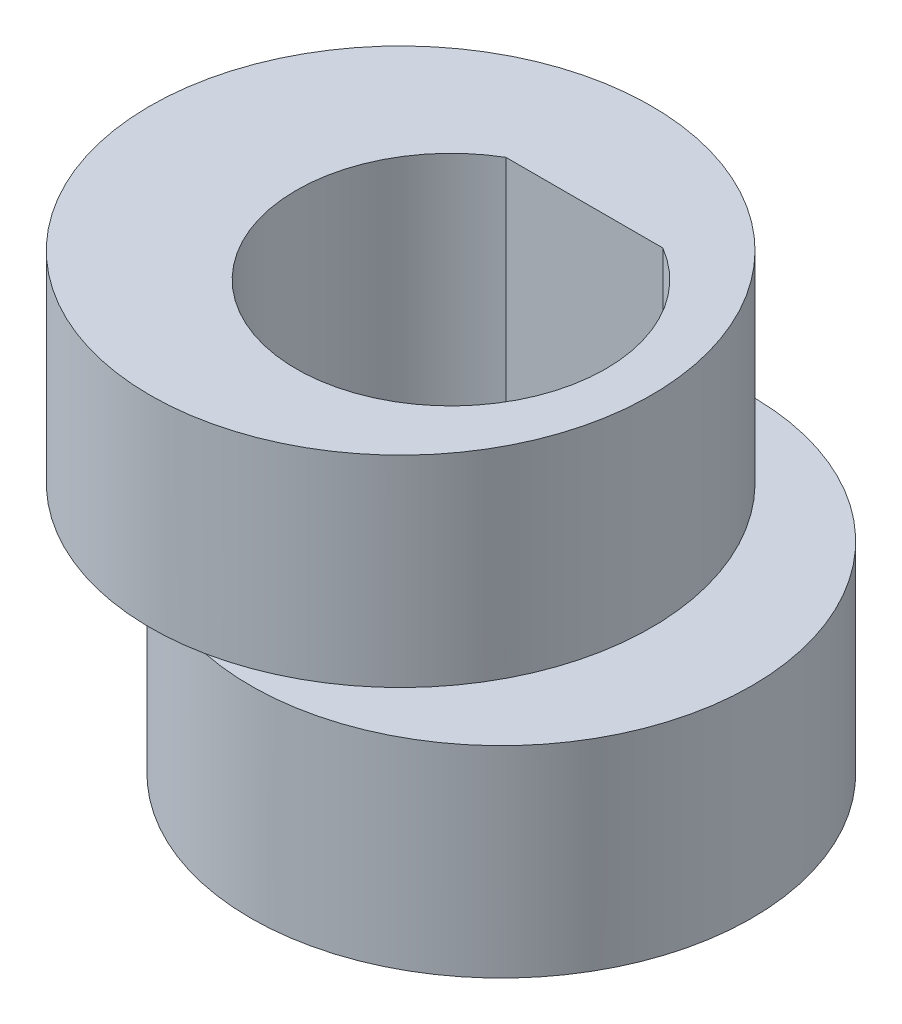
ISO-10303-21;
HEADER;
FILE_DESCRIPTION(('STEP AP214'),'2;1');
FILE_NAME('part.step','',(''),(''),'','','');
FILE_SCHEMA(('AUTOMOTIVE_DESIGN { 1 0 10303 214 1 1 1 1 }'));
ENDSEC;
DATA;
#1=APPLICATION_CONTEXT('core data for automotive mechanical design processes');
#2=APPLICATION_PROTOCOL_DEFINITION('international standard','automotive_design',2000,#1);
#3=PRODUCT_CONTEXT('',#1,'mechanical');
#4=PRODUCT('Part','Part','',(#3));
#5=PRODUCT_RELATED_PRODUCT_CATEGORY('part','',(#4));
#6=PRODUCT_DEFINITION_FORMATION('','',#4);
#7=PRODUCT_DEFINITION_CONTEXT('part definition',#1,'design');
#8=PRODUCT_DEFINITION('design','',#6,#7);
#9=PRODUCT_DEFINITION_SHAPE('','',#8);
#10=(LENGTH_UNIT() NAMED_UNIT(*) SI_UNIT(.MILLI.,.METRE.));
#11=(NAMED_UNIT(*) PLANE_ANGLE_UNIT() SI_UNIT($,.RADIAN.));
#12=(NAMED_UNIT(*) SI_UNIT($,.STERADIAN.) SOLID_ANGLE_UNIT());
#13=UNCERTAINTY_MEASURE_WITH_UNIT(LENGTH_MEASURE(1.E-05),#10,'distance_accuracy_value','');
#14=(GEOMETRIC_REPRESENTATION_CONTEXT(3) GLOBAL_UNCERTAINTY_ASSIGNED_CONTEXT((#13)) GLOBAL_UNIT_ASSIGNED_CONTEXT((#10,
#11,#12)) REPRESENTATION_CONTEXT('',''));
#15=CARTESIAN_POINT('',(0.,0.,0.));
#16=DIRECTION('',(0.,0.,1.));
#17=DIRECTION('',(1.,0.,0.));
#18=AXIS2_PLACEMENT_3D('',#15,#16,#17);
#19=CARTESIAN_POINT('',(1.,0.,0.));
#20=DIRECTION('',(0.,1.,0.));
#21=DIRECTION('',(0.,0.,1.));
#22=AXIS2_PLACEMENT_3D('',#19,#20,#21);
#23=PLANE('',#22);
#24=CARTESIAN_POINT('',(1.,0.,0.));
#25=DIRECTION('',(0.,1.,0.));
#26=DIRECTION('',(0.,0.,1.));
#27=AXIS2_PLACEMENT_3D('',#24,#25,#26);
#28=CIRCLE('',#27,4.98);
#29=CARTESIAN_POINT('',(1.,0.,4.98));
#30=VERTEX_POINT('',#29);
#31=EDGE_CURVE('E39',#30,#30,#28,.T.);
#32=ORIENTED_EDGE('',*,*,#31,.F.);
#33=EDGE_LOOP('',(#32));
#34=FACE_BOUND('',#33,.T.);
#35=CARTESIAN_POINT('',(0.,0.,0.));
#36=DIRECTION('',(0.,1.,0.));
#37=DIRECTION('',(0.,0.,1.));
#38=AXIS2_PLACEMENT_3D('',#35,#36,#37);
#39=CIRCLE('',#38,3.075);
#40=CARTESIAN_POINT('',(-1.55984774898065,0.,-2.65));
#41=VERTEX_POINT('',#40);
#42=CARTESIAN_POINT('',(1.55984774898065,0.,-2.65));
#43=VERTEX_POINT('',#42);
#44=EDGE_CURVE('E51',#41,#43,#39,.T.);
#45=ORIENTED_EDGE('',*,*,#44,.T.);
#46=DIRECTION('',(-1.,0.,0.));
#47=VECTOR('',#46,1.);
#48=CARTESIAN_POINT('',(-1.55984774898065,0.,-2.65));
#49=LINE('',#48,#47);
#50=EDGE_CURVE('E81',#43,#41,#49,.T.);
#51=ORIENTED_EDGE('',*,*,#50,.T.);
#52=EDGE_LOOP('',(#45,#51));
#53=FACE_BOUND('',#52,.T.);
#54=ADVANCED_FACE('F35',(#34,#53),#23,.F.);
#55=CARTESIAN_POINT('',(-1.,8.,0.));
#56=DIRECTION('',(0.,1.,0.));
#57=DIRECTION('',(0.,0.,1.));
#58=AXIS2_PLACEMENT_3D('',#55,#56,#57);
#59=PLANE('',#58);
#60=CARTESIAN_POINT('',(-1.,8.,0.));
#61=DIRECTION('',(0.,1.,0.));
#62=DIRECTION('',(0.,0.,1.));
#63=AXIS2_PLACEMENT_3D('',#60,#61,#62);
#64=CIRCLE('',#63,4.98);
#65=CARTESIAN_POINT('',(-1.,8.,4.98));
#66=VERTEX_POINT('',#65);
#67=EDGE_CURVE('E88',#66,#66,#64,.T.);
#68=ORIENTED_EDGE('',*,*,#67,.T.);
#69=EDGE_LOOP('',(#68));
#70=FACE_BOUND('',#69,.T.);
#71=DIRECTION('',(-1.,0.,0.));
#72=VECTOR('',#71,1.);
#73=CARTESIAN_POINT('',(-1.55984774898065,8.,-2.65));
#74=LINE('',#73,#72);
#75=CARTESIAN_POINT('',(1.55984774898065,8.,-2.65));
#76=VERTEX_POINT('',#75);
#77=CARTESIAN_POINT('',(-1.55984774898065,8.,-2.65));
#78=VERTEX_POINT('',#77);
#79=EDGE_CURVE('E70',#76,#78,#74,.T.);
#80=ORIENTED_EDGE('',*,*,#79,.F.);
#81=CARTESIAN_POINT('',(0.,8.,0.));
#82=DIRECTION('',(0.,1.,0.));
#83=DIRECTION('',(0.,0.,1.));
#84=AXIS2_PLACEMENT_3D('',#81,#82,#83);
#85=CIRCLE('',#84,3.075);
#86=EDGE_CURVE('E76',#78,#76,#85,.T.);
#87=ORIENTED_EDGE('',*,*,#86,.F.);
#88=EDGE_LOOP('',(#80,#87));
#89=FACE_BOUND('',#88,.T.);
#90=ADVANCED_FACE('F80',(#70,#89),#59,.T.);
#91=CARTESIAN_POINT('',(1.,4.,0.));
#92=DIRECTION('',(0.,-1.,0.));
#93=DIRECTION('',(0.,0.,-1.));
#94=AXIS2_PLACEMENT_3D('',#91,#92,#93);
#95=CYLINDRICAL_SURFACE('',#94,4.98);
#96=CARTESIAN_POINT('',(1.,4.,0.));
#97=DIRECTION('',(0.,1.,0.));
#98=DIRECTION('',(0.,0.,1.));
#99=AXIS2_PLACEMENT_3D('',#96,#97,#98);
#100=CIRCLE('',#99,4.98);
#101=CARTESIAN_POINT('',(0.,4.,-4.87856536289102));
#102=VERTEX_POINT('',#101);
#103=CARTESIAN_POINT('',(0.,4.,4.87856536289102));
#104=VERTEX_POINT('',#103);
#105=EDGE_CURVE('E11',#102,#104,#100,.T.);
#106=ORIENTED_EDGE('',*,*,#105,.F.);
#107=EDGE_CURVE('E44',#104,#102,#100,.T.);
#108=ORIENTED_EDGE('',*,*,#107,.F.);
#109=EDGE_LOOP('',(#106,#108));
#110=FACE_BOUND('',#109,.T.);
#111=ORIENTED_EDGE('',*,*,#31,.T.);
#112=EDGE_LOOP('',(#111));
#113=FACE_BOUND('',#112,.T.);
#114=ADVANCED_FACE('F37',(#110,#113),#95,.T.);
#115=CARTESIAN_POINT('',(1.,4.,0.));
#116=DIRECTION('',(0.,1.,0.));
#117=DIRECTION('',(0.,0.,1.));
#118=AXIS2_PLACEMENT_3D('',#115,#116,#117);
#119=PLANE('',#118);
#120=CARTESIAN_POINT('',(-1.,4.,0.));
#121=DIRECTION('',(0.,1.,0.));
#122=DIRECTION('',(0.,0.,1.));
#123=AXIS2_PLACEMENT_3D('',#120,#121,#122);
#124=CIRCLE('',#123,4.98);
#125=EDGE_CURVE('E91',#104,#102,#124,.T.);
#126=ORIENTED_EDGE('',*,*,#125,.F.);
#127=ORIENTED_EDGE('',*,*,#107,.T.);
#128=EDGE_LOOP('',(#126,#127));
#129=FACE_BOUND('',#128,.T.);
#130=ADVANCED_FACE('F104',(#129),#119,.T.);
#131=CARTESIAN_POINT('',(-1.,4.,0.));
#132=DIRECTION('',(0.,1.,0.));
#133=DIRECTION('',(0.,0.,1.));
#134=AXIS2_PLACEMENT_3D('',#131,#132,#133);
#135=PLANE('',#134);
#136=EDGE_CURVE('E87',#102,#104,#124,.T.);
#137=ORIENTED_EDGE('',*,*,#136,.F.);
#138=ORIENTED_EDGE('',*,*,#105,.T.);
#139=EDGE_LOOP('',(#137,#138));
#140=FACE_BOUND('',#139,.T.);
#141=ADVANCED_FACE('F98',(#140),#135,.F.);
#142=CARTESIAN_POINT('',(-1.,8.,0.));
#143=DIRECTION('',(0.,-1.,0.));
#144=DIRECTION('',(0.,0.,-1.));
#145=AXIS2_PLACEMENT_3D('',#142,#143,#144);
#146=CYLINDRICAL_SURFACE('',#145,4.98);
#147=ORIENTED_EDGE('',*,*,#67,.F.);
#148=EDGE_LOOP('',(#147));
#149=FACE_BOUND('',#148,.T.);
#150=ORIENTED_EDGE('',*,*,#125,.T.);
#151=ORIENTED_EDGE('',*,*,#136,.T.);
#152=EDGE_LOOP('',(#150,#151));
#153=FACE_BOUND('',#152,.T.);
#154=ADVANCED_FACE('F96',(#149,#153),#146,.T.);
#155=CARTESIAN_POINT('',(0.,8.,0.));
#156=DIRECTION('',(0.,-1.,0.));
#157=DIRECTION('',(0.,0.,-1.));
#158=AXIS2_PLACEMENT_3D('',#155,#156,#157);
#159=CYLINDRICAL_SURFACE('',#158,3.075);
#160=ORIENTED_EDGE('',*,*,#44,.F.);
#161=DIRECTION('',(0.,-1.,0.));
#162=VECTOR('',#161,1.);
#163=CARTESIAN_POINT('',(-1.55984774898065,8.,-2.65));
#164=LINE('',#163,#162);
#165=EDGE_CURVE('E72',#78,#41,#164,.T.);
#166=ORIENTED_EDGE('',*,*,#165,.F.);
#167=ORIENTED_EDGE('',*,*,#86,.T.);
#168=DIRECTION('',(0.,-1.,0.));
#169=VECTOR('',#168,1.);
#170=CARTESIAN_POINT('',(1.55984774898065,8.,-2.65));
#171=LINE('',#170,#169);
#172=EDGE_CURVE('E58',#76,#43,#171,.T.);
#173=ORIENTED_EDGE('',*,*,#172,.T.);
#174=EDGE_LOOP('',(#160,#166,#167,#173));
#175=FACE_BOUND('',#174,.T.);
#176=ADVANCED_FACE('F78',(#175),#159,.F.);
#177=CARTESIAN_POINT('',(-1.55984774898065,8.,-2.65));
#178=DIRECTION('',(0.,0.,1.));
#179=DIRECTION('',(1.,0.,0.));
#180=AXIS2_PLACEMENT_3D('',#177,#178,#179);
#181=PLANE('',#180);
#182=ORIENTED_EDGE('',*,*,#50,.F.);
#183=ORIENTED_EDGE('',*,*,#172,.F.);
#184=ORIENTED_EDGE('',*,*,#79,.T.);
#185=ORIENTED_EDGE('',*,*,#165,.T.);
#186=EDGE_LOOP('',(#182,#183,#184,#185));
#187=FACE_BOUND('',#186,.T.);
#188=ADVANCED_FACE('F71',(#187),#181,.T.);
#189=CLOSED_SHELL('',(#54,#90,#114,#130,#141,#154,#176,#188));
#190=MANIFOLD_SOLID_BREP('B2',#189);
#191=ADVANCED_BREP_SHAPE_REPRESENTATION('',(#18,#190),#14);
#192=SHAPE_DEFINITION_REPRESENTATION(#9,#191);
ENDSEC;
END-ISO-10303-21;
